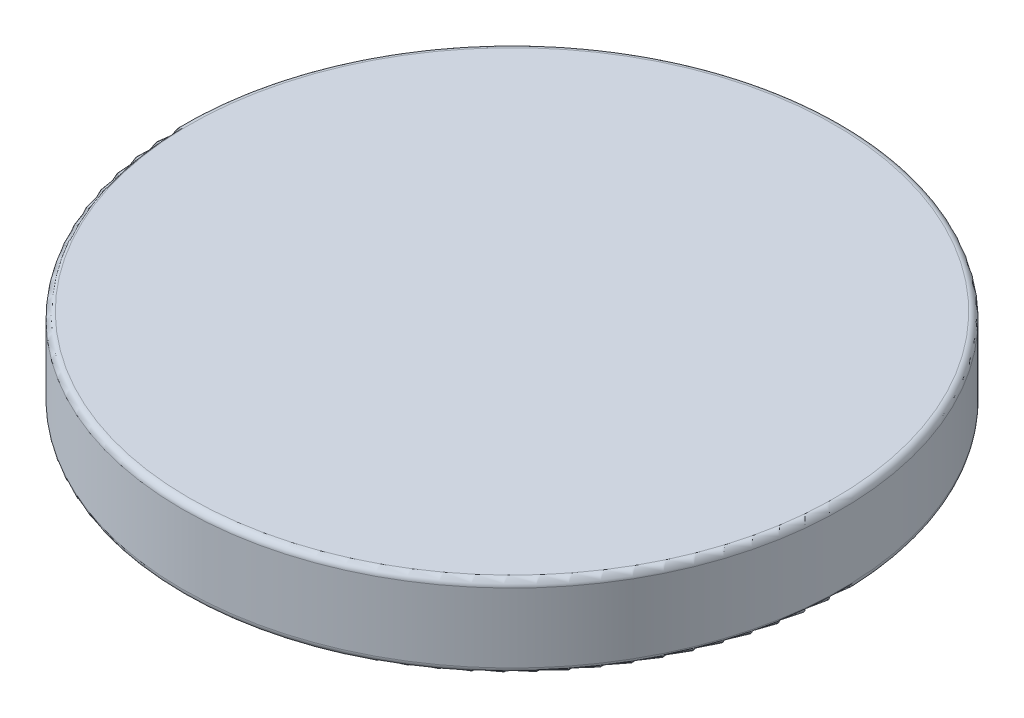
ISO-10303-21;
HEADER;
FILE_DESCRIPTION(('STEP AP214'),'2;1');
FILE_NAME('part.step','',(''),(''),'','','');
FILE_SCHEMA(('AUTOMOTIVE_DESIGN { 1 0 10303 214 1 1 1 1 }'));
ENDSEC;
DATA;
#1=APPLICATION_CONTEXT('core data for automotive mechanical design processes');
#2=APPLICATION_PROTOCOL_DEFINITION('international standard','automotive_design',2000,#1);
#3=PRODUCT_CONTEXT('',#1,'mechanical');
#4=PRODUCT('Part','Part','',(#3));
#5=PRODUCT_RELATED_PRODUCT_CATEGORY('part','',(#4));
#6=PRODUCT_DEFINITION_FORMATION('','',#4);
#7=PRODUCT_DEFINITION_CONTEXT('part definition',#1,'design');
#8=PRODUCT_DEFINITION('design','',#6,#7);
#9=PRODUCT_DEFINITION_SHAPE('','',#8);
#10=(LENGTH_UNIT() NAMED_UNIT(*) SI_UNIT(.MILLI.,.METRE.));
#11=(NAMED_UNIT(*) PLANE_ANGLE_UNIT() SI_UNIT($,.RADIAN.));
#12=(NAMED_UNIT(*) SI_UNIT($,.STERADIAN.) SOLID_ANGLE_UNIT());
#13=UNCERTAINTY_MEASURE_WITH_UNIT(LENGTH_MEASURE(1.E-05),#10,'distance_accuracy_value','');
#14=(GEOMETRIC_REPRESENTATION_CONTEXT(3) GLOBAL_UNCERTAINTY_ASSIGNED_CONTEXT((#13)) GLOBAL_UNIT_ASSIGNED_CONTEXT((#10,
#11,#12)) REPRESENTATION_CONTEXT('',''));
#15=CARTESIAN_POINT('',(0.,0.,0.));
#16=DIRECTION('',(0.,0.,1.));
#17=DIRECTION('',(1.,0.,0.));
#18=AXIS2_PLACEMENT_3D('',#15,#16,#17);
#19=CARTESIAN_POINT('',(0.,3.175,0.));
#20=DIRECTION('',(0.,-1.,0.));
#21=DIRECTION('',(0.,0.,-1.));
#22=AXIS2_PLACEMENT_3D('',#19,#20,#21);
#23=CYLINDRICAL_SURFACE('',#22,12.7);
#24=CARTESIAN_POINT('',(0.,2.921,0.));
#25=DIRECTION('',(0.,1.,0.));
#26=DIRECTION('',(0.,0.,1.));
#27=AXIS2_PLACEMENT_3D('',#24,#25,#26);
#28=CIRCLE('',#27,12.7);
#29=CARTESIAN_POINT('',(0.,2.921,12.7));
#30=VERTEX_POINT('',#29);
#31=EDGE_CURVE('E45',#30,#30,#28,.F.);
#32=ORIENTED_EDGE('',*,*,#31,.T.);
#33=EDGE_LOOP('',(#32));
#34=FACE_BOUND('',#33,.T.);
#35=CARTESIAN_POINT('',(0.,0.254,0.));
#36=DIRECTION('',(0.,1.,0.));
#37=DIRECTION('',(0.,0.,1.));
#38=AXIS2_PLACEMENT_3D('',#35,#36,#37);
#39=CIRCLE('',#38,12.7);
#40=CARTESIAN_POINT('',(0.,0.254,12.7));
#41=VERTEX_POINT('',#40);
#42=EDGE_CURVE('E50',#41,#41,#39,.T.);
#43=ORIENTED_EDGE('',*,*,#42,.T.);
#44=EDGE_LOOP('',(#43));
#45=FACE_BOUND('',#44,.T.);
#46=ADVANCED_FACE('F37',(#34,#45),#23,.T.);
#47=CARTESIAN_POINT('',(0.,3.175,0.));
#48=DIRECTION('',(0.,1.,0.));
#49=DIRECTION('',(0.,0.,1.));
#50=AXIS2_PLACEMENT_3D('',#47,#48,#49);
#51=PLANE('',#50);
#52=CARTESIAN_POINT('',(0.,3.175,0.));
#53=DIRECTION('',(0.,1.,0.));
#54=DIRECTION('',(0.,0.,1.));
#55=AXIS2_PLACEMENT_3D('',#52,#53,#54);
#56=CIRCLE('',#55,12.446);
#57=CARTESIAN_POINT('',(0.,3.175,12.446));
#58=VERTEX_POINT('',#57);
#59=EDGE_CURVE('E55',#58,#58,#56,.T.);
#60=ORIENTED_EDGE('',*,*,#59,.T.);
#61=EDGE_LOOP('',(#60));
#62=FACE_BOUND('',#61,.T.);
#63=ADVANCED_FACE('F62',(#62),#51,.T.);
#64=CARTESIAN_POINT('',(0.,0.,0.));
#65=DIRECTION('',(0.,1.,0.));
#66=DIRECTION('',(0.,0.,1.));
#67=AXIS2_PLACEMENT_3D('',#64,#65,#66);
#68=PLANE('',#67);
#69=CARTESIAN_POINT('',(0.,0.,0.));
#70=DIRECTION('',(0.,1.,0.));
#71=DIRECTION('',(0.,0.,1.));
#72=AXIS2_PLACEMENT_3D('',#69,#70,#71);
#73=CIRCLE('',#72,12.446);
#74=CARTESIAN_POINT('',(0.,0.,12.446));
#75=VERTEX_POINT('',#74);
#76=EDGE_CURVE('E10',#75,#75,#73,.F.);
#77=ORIENTED_EDGE('',*,*,#76,.T.);
#78=EDGE_LOOP('',(#77));
#79=FACE_BOUND('',#78,.T.);
#80=ADVANCED_FACE('F66',(#79),#68,.F.);
#81=CARTESIAN_POINT('',(0.,2.921,0.));
#82=DIRECTION('',(0.,1.,0.));
#83=DIRECTION('',(0.,0.,1.));
#84=AXIS2_PLACEMENT_3D('',#81,#82,#83);
#85=TOROIDAL_SURFACE('',#84,12.446,0.254);
#86=ORIENTED_EDGE('',*,*,#31,.F.);
#87=EDGE_LOOP('',(#86));
#88=FACE_BOUND('',#87,.T.);
#89=ORIENTED_EDGE('',*,*,#59,.F.);
#90=EDGE_LOOP('',(#89));
#91=FACE_BOUND('',#90,.T.);
#92=ADVANCED_FACE('F64',(#88,#91),#85,.T.);
#93=CARTESIAN_POINT('',(0.,0.254,0.));
#94=DIRECTION('',(0.,1.,0.));
#95=DIRECTION('',(0.,0.,1.));
#96=AXIS2_PLACEMENT_3D('',#93,#94,#95);
#97=TOROIDAL_SURFACE('',#96,12.446,0.254);
#98=ORIENTED_EDGE('',*,*,#76,.F.);
#99=EDGE_LOOP('',(#98));
#100=FACE_BOUND('',#99,.T.);
#101=ORIENTED_EDGE('',*,*,#42,.F.);
#102=EDGE_LOOP('',(#101));
#103=FACE_BOUND('',#102,.T.);
#104=ADVANCED_FACE('F39',(#100,#103),#97,.T.);
#105=CLOSED_SHELL('',(#46,#63,#80,#92,#104));
#106=MANIFOLD_SOLID_BREP('B2',#105);
#107=ADVANCED_BREP_SHAPE_REPRESENTATION('',(#18,#106),#14);
#108=SHAPE_DEFINITION_REPRESENTATION(#9,#107);
ENDSEC;
END-ISO-10303-21;
